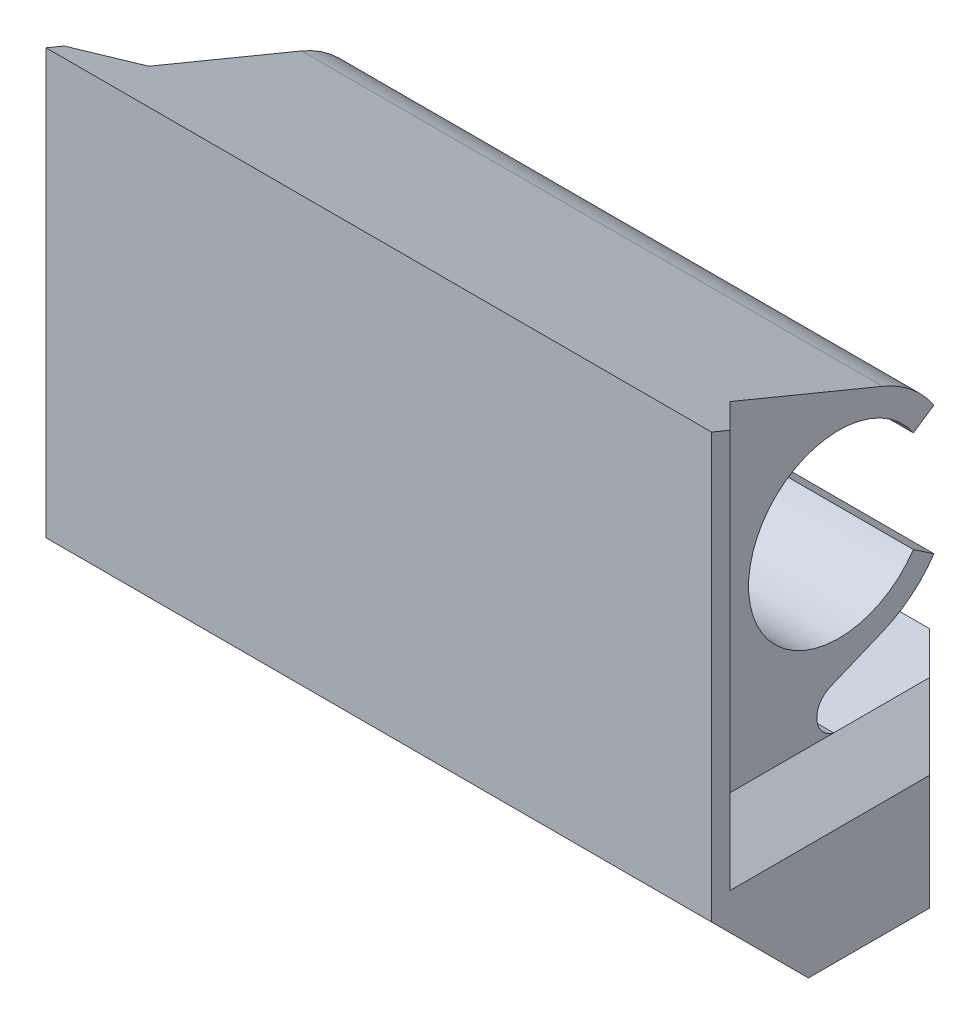
ISO-10303-21;
HEADER;
FILE_DESCRIPTION(('STEP AP214'),'2;1');
FILE_NAME('part.step','',(''),(''),'','','');
FILE_SCHEMA(('AUTOMOTIVE_DESIGN { 1 0 10303 214 1 1 1 1 }'));
ENDSEC;
DATA;
#1=APPLICATION_CONTEXT('core data for automotive mechanical design processes');
#2=APPLICATION_PROTOCOL_DEFINITION('international standard','automotive_design',2000,#1);
#3=PRODUCT_CONTEXT('',#1,'mechanical');
#4=PRODUCT('Part','Part','',(#3));
#5=PRODUCT_RELATED_PRODUCT_CATEGORY('part','',(#4));
#6=PRODUCT_DEFINITION_FORMATION('','',#4);
#7=PRODUCT_DEFINITION_CONTEXT('part definition',#1,'design');
#8=PRODUCT_DEFINITION('design','',#6,#7);
#9=PRODUCT_DEFINITION_SHAPE('','',#8);
#10=(LENGTH_UNIT() NAMED_UNIT(*) SI_UNIT(.MILLI.,.METRE.));
#11=(NAMED_UNIT(*) PLANE_ANGLE_UNIT() SI_UNIT($,.RADIAN.));
#12=(NAMED_UNIT(*) SI_UNIT($,.STERADIAN.) SOLID_ANGLE_UNIT());
#13=UNCERTAINTY_MEASURE_WITH_UNIT(LENGTH_MEASURE(1.E-05),#10,'distance_accuracy_value','');
#14=(GEOMETRIC_REPRESENTATION_CONTEXT(3) GLOBAL_UNCERTAINTY_ASSIGNED_CONTEXT((#13)) GLOBAL_UNIT_ASSIGNED_CONTEXT((#10,
#11,#12)) REPRESENTATION_CONTEXT('',''));
#15=CARTESIAN_POINT('',(0.,0.,0.));
#16=DIRECTION('',(0.,0.,1.));
#17=DIRECTION('',(1.,0.,0.));
#18=AXIS2_PLACEMENT_3D('',#15,#16,#17);
#19=CARTESIAN_POINT('',(44.6457740364154,6.77952065166529,-20.));
#20=DIRECTION('',(0.,1.,0.));
#21=DIRECTION('',(0.,0.,1.));
#22=AXIS2_PLACEMENT_3D('',#19,#20,#21);
#23=PLANE('',#22);
#24=DIRECTION('',(0.,0.,-1.));
#25=VECTOR('',#24,1.);
#26=CARTESIAN_POINT('',(41.1457740364154,6.77952065166529,-20.));
#27=LINE('',#26,#25);
#28=CARTESIAN_POINT('',(41.1457740364154,6.77952065166529,-8.5764706950357));
#29=VERTEX_POINT('',#28);
#30=CARTESIAN_POINT('',(41.1457740364154,6.77952065166529,-16.5));
#31=VERTEX_POINT('',#30);
#32=EDGE_CURVE('E229',#29,#31,#27,.T.);
#33=ORIENTED_EDGE('',*,*,#32,.T.);
#34=DIRECTION('',(0.707106781186549,0.,0.707106781186546));
#35=VECTOR('',#34,1.);
#36=CARTESIAN_POINT('',(41.1457740364154,6.77952065166529,-16.5));
#37=LINE('',#36,#35);
#38=CARTESIAN_POINT('',(37.6457740364154,6.77952065166529,-20.));
#39=VERTEX_POINT('',#38);
#40=EDGE_CURVE('E241',#31,#39,#37,.F.);
#41=ORIENTED_EDGE('',*,*,#40,.T.);
#42=DIRECTION('',(-1.,0.,0.));
#43=VECTOR('',#42,1.);
#44=CARTESIAN_POINT('',(44.6457740364154,6.77952065166529,-20.));
#45=LINE('',#44,#43);
#46=CARTESIAN_POINT('',(-3.35422596358456,6.77952065166529,-20.));
#47=VERTEX_POINT('',#46);
#48=EDGE_CURVE('E344',#39,#47,#45,.T.);
#49=ORIENTED_EDGE('',*,*,#48,.T.);
#50=DIRECTION('',(-0.707106781186546,0.,0.707106781186549));
#51=VECTOR('',#50,1.);
#52=CARTESIAN_POINT('',(20.6457740364153,6.77952065166529,-44.));
#53=LINE('',#52,#51);
#54=CARTESIAN_POINT('',(-6.85422596358455,6.77952065166529,-16.5));
#55=VERTEX_POINT('',#54);
#56=EDGE_CURVE('E239',#47,#55,#53,.T.);
#57=ORIENTED_EDGE('',*,*,#56,.T.);
#58=DIRECTION('',(0.,0.,1.));
#59=VECTOR('',#58,1.);
#60=CARTESIAN_POINT('',(-6.85422596358455,6.77952065166529,-20.));
#61=LINE('',#60,#59);
#62=CARTESIAN_POINT('',(-6.85422596358456,6.77952065166529,-8.57647069503573));
#63=VERTEX_POINT('',#62);
#64=EDGE_CURVE('E212',#55,#63,#61,.T.);
#65=ORIENTED_EDGE('',*,*,#64,.T.);
#66=DIRECTION('',(-1.,0.,0.));
#67=VECTOR('',#66,1.);
#68=CARTESIAN_POINT('',(41.1457740364154,6.77952065166528,-8.57647069503573));
#69=LINE('',#68,#67);
#70=EDGE_CURVE('E273',#29,#63,#69,.T.);
#71=ORIENTED_EDGE('',*,*,#70,.F.);
#72=EDGE_LOOP('',(#33,#41,#49,#57,#65,#71));
#73=FACE_BOUND('',#72,.T.);
#74=ADVANCED_FACE('F33',(#73),#23,.T.);
#75=CARTESIAN_POINT('',(-10.3542259635846,-6.22047934833471,5.));
#76=DIRECTION('',(-1.,0.,0.));
#77=DIRECTION('',(0.,0.,1.));
#78=AXIS2_PLACEMENT_3D('',#75,#76,#77);
#79=PLANE('',#78);
#80=DIRECTION('',(0.,0.,-1.));
#81=VECTOR('',#80,1.);
#82=CARTESIAN_POINT('',(-10.3542259635846,3.27952065166527,5.));
#83=LINE('',#82,#81);
#84=CARTESIAN_POINT('',(-10.3542259635846,3.27952065166527,3.50000000000002));
#85=VERTEX_POINT('',#84);
#86=CARTESIAN_POINT('',(-10.3542259635846,3.27952065166527,-13.));
#87=VERTEX_POINT('',#86);
#88=EDGE_CURVE('E216',#85,#87,#83,.T.);
#89=ORIENTED_EDGE('',*,*,#88,.T.);
#90=DIRECTION('',(0.,-1.,0.));
#91=VECTOR('',#90,1.);
#92=CARTESIAN_POINT('',(-10.3542259635846,-6.22047934833471,-13.));
#93=LINE('',#92,#91);
#94=CARTESIAN_POINT('',(-10.3542259635846,-6.22047934833471,-13.));
#95=VERTEX_POINT('',#94);
#96=EDGE_CURVE('E11',#87,#95,#93,.T.);
#97=ORIENTED_EDGE('',*,*,#96,.T.);
#98=DIRECTION('',(0.,0.,-1.));
#99=VECTOR('',#98,1.);
#100=CARTESIAN_POINT('',(-10.3542259635846,-6.22047934833471,5.));
#101=LINE('',#100,#99);
#102=CARTESIAN_POINT('',(-10.3542259635846,-6.22047934833471,-3.00000000000001));
#103=VERTEX_POINT('',#102);
#104=EDGE_CURVE('E198',#103,#95,#101,.T.);
#105=ORIENTED_EDGE('',*,*,#104,.F.);
#106=DIRECTION('',(0.,-0.707106781186546,-0.707106781186549));
#107=VECTOR('',#106,1.);
#108=CARTESIAN_POINT('',(-10.3542259635846,-2.2204793483347,1.00000000000001));
#109=LINE('',#108,#107);
#110=CARTESIAN_POINT('',(-10.3542259635846,1.77952065166527,5.));
#111=VERTEX_POINT('',#110);
#112=EDGE_CURVE('E210',#103,#111,#109,.F.);
#113=ORIENTED_EDGE('',*,*,#112,.T.);
#114=DIRECTION('',(0.,1.,0.));
#115=VECTOR('',#114,1.);
#116=CARTESIAN_POINT('',(-10.3542259635846,-6.22047934833471,5.));
#117=LINE('',#116,#115);
#118=CARTESIAN_POINT('',(-10.3542259635846,36.8463738964464,5.));
#119=VERTEX_POINT('',#118);
#120=EDGE_CURVE('E196',#111,#119,#117,.T.);
#121=ORIENTED_EDGE('',*,*,#120,.T.);
#122=DIRECTION('',(0.,0.382018430191151,0.92415470511938));
#123=VECTOR('',#122,1.);
#124=CARTESIAN_POINT('',(-10.3542259635846,34.7795206516653,0.));
#125=LINE('',#124,#123);
#126=CARTESIAN_POINT('',(-10.3542259635846,36.2263179230121,3.50000000000002));
#127=VERTEX_POINT('',#126);
#128=EDGE_CURVE('E181',#127,#119,#125,.T.);
#129=ORIENTED_EDGE('',*,*,#128,.F.);
#130=DIRECTION('',(0.,-1.,0.));
#131=VECTOR('',#130,1.);
#132=CARTESIAN_POINT('',(-10.3542259635846,-6.22047934833471,3.50000000000002));
#133=LINE('',#132,#131);
#134=EDGE_CURVE('E214',#127,#85,#133,.T.);
#135=ORIENTED_EDGE('',*,*,#134,.T.);
#136=EDGE_LOOP('',(#89,#97,#105,#113,#121,#129,#135));
#137=FACE_BOUND('',#136,.T.);
#138=ADVANCED_FACE('F367',(#137),#79,.T.);
#139=CARTESIAN_POINT('',(-10.3542259635846,-6.22047934833471,5.));
#140=DIRECTION('',(0.,1.,0.));
#141=DIRECTION('',(0.,0.,1.));
#142=AXIS2_PLACEMENT_3D('',#139,#140,#141);
#143=PLANE('',#142);
#144=CARTESIAN_POINT('',(-0.354225963584559,-6.22047934833471,-11.));
#145=DIRECTION('',(0.,-1.,0.));
#146=DIRECTION('',(0.,0.,-1.));
#147=AXIS2_PLACEMENT_3D('',#144,#145,#146);
#148=CIRCLE('',#147,4.5);
#149=CARTESIAN_POINT('',(-0.354225963584559,-6.22047934833471,-15.5));
#150=VERTEX_POINT('',#149);
#151=EDGE_CURVE('E345',#150,#150,#148,.T.);
#152=ORIENTED_EDGE('',*,*,#151,.F.);
#153=EDGE_LOOP('',(#152));
#154=FACE_BOUND('',#153,.T.);
#155=CARTESIAN_POINT('',(34.6457740364154,-6.22047934833471,-11.));
#156=DIRECTION('',(0.,-1.,0.));
#157=DIRECTION('',(0.,0.,-1.));
#158=AXIS2_PLACEMENT_3D('',#155,#156,#157);
#159=CIRCLE('',#158,4.5);
#160=CARTESIAN_POINT('',(34.6457740364154,-6.22047934833471,-15.5));
#161=VERTEX_POINT('',#160);
#162=EDGE_CURVE('E280',#161,#161,#159,.T.);
#163=ORIENTED_EDGE('',*,*,#162,.F.);
#164=EDGE_LOOP('',(#163));
#165=FACE_BOUND('',#164,.T.);
#166=DIRECTION('',(-1.,0.,0.));
#167=VECTOR('',#166,1.);
#168=CARTESIAN_POINT('',(44.6457740364154,-6.22047934833471,-20.));
#169=LINE('',#168,#167);
#170=CARTESIAN_POINT('',(37.6457740364154,-6.22047934833471,-20.));
#171=VERTEX_POINT('',#170);
#172=CARTESIAN_POINT('',(-3.35422596358456,-6.22047934833471,-20.));
#173=VERTEX_POINT('',#172);
#174=EDGE_CURVE('E200',#171,#173,#169,.T.);
#175=ORIENTED_EDGE('',*,*,#174,.F.);
#176=DIRECTION('',(-0.707106781186549,0.,-0.707106781186546));
#177=VECTOR('',#176,1.);
#178=CARTESIAN_POINT('',(44.6457740364154,-6.22047934833471,-13.));
#179=LINE('',#178,#177);
#180=CARTESIAN_POINT('',(44.6457740364154,-6.22047934833471,-13.));
#181=VERTEX_POINT('',#180);
#182=EDGE_CURVE('E250',#171,#181,#179,.F.);
#183=ORIENTED_EDGE('',*,*,#182,.T.);
#184=DIRECTION('',(0.,0.,-1.));
#185=VECTOR('',#184,1.);
#186=CARTESIAN_POINT('',(44.6457740364154,-6.22047934833471,5.));
#187=LINE('',#186,#185);
#188=CARTESIAN_POINT('',(44.6457740364154,-6.22047934833471,-3.00000000000001));
#189=VERTEX_POINT('',#188);
#190=EDGE_CURVE('E195',#189,#181,#187,.T.);
#191=ORIENTED_EDGE('',*,*,#190,.F.);
#192=DIRECTION('',(-1.,0.,0.));
#193=VECTOR('',#192,1.);
#194=CARTESIAN_POINT('',(-10.3542259635846,-6.22047934833471,-3.00000000000001));
#195=LINE('',#194,#193);
#196=EDGE_CURVE('E208',#189,#103,#195,.T.);
#197=ORIENTED_EDGE('',*,*,#196,.T.);
#198=ORIENTED_EDGE('',*,*,#104,.T.);
#199=DIRECTION('',(0.707106781186546,0.,-0.707106781186549));
#200=VECTOR('',#199,1.);
#201=CARTESIAN_POINT('',(-3.35422596358457,-6.22047934833471,-20.));
#202=LINE('',#201,#200);
#203=EDGE_CURVE('E248',#95,#173,#202,.T.);
#204=ORIENTED_EDGE('',*,*,#203,.T.);
#205=EDGE_LOOP('',(#175,#183,#191,#197,#198,#204));
#206=FACE_BOUND('',#205,.T.);
#207=ADVANCED_FACE('F255',(#154,#165,#206),#143,.F.);
#208=CARTESIAN_POINT('',(44.6457740364154,-6.22047934833471,5.));
#209=DIRECTION('',(-1.,0.,0.));
#210=DIRECTION('',(0.,0.,1.));
#211=AXIS2_PLACEMENT_3D('',#208,#209,#210);
#212=PLANE('',#211);
#213=ORIENTED_EDGE('',*,*,#190,.T.);
#214=DIRECTION('',(0.,1.,0.));
#215=VECTOR('',#214,1.);
#216=CARTESIAN_POINT('',(44.6457740364154,-6.22047934833471,-13.));
#217=LINE('',#216,#215);
#218=CARTESIAN_POINT('',(44.6457740364154,3.27952065166529,-13.));
#219=VERTEX_POINT('',#218);
#220=EDGE_CURVE('E232',#181,#219,#217,.T.);
#221=ORIENTED_EDGE('',*,*,#220,.T.);
#222=DIRECTION('',(0.,0.,1.));
#223=VECTOR('',#222,1.);
#224=CARTESIAN_POINT('',(44.6457740364154,3.27952065166529,0.));
#225=LINE('',#224,#223);
#226=CARTESIAN_POINT('',(44.6457740364154,3.27952065166529,3.5));
#227=VERTEX_POINT('',#226);
#228=EDGE_CURVE('E220',#219,#227,#225,.T.);
#229=ORIENTED_EDGE('',*,*,#228,.T.);
#230=DIRECTION('',(0.,1.,0.));
#231=VECTOR('',#230,1.);
#232=CARTESIAN_POINT('',(44.6457740364154,34.7795206516653,3.5));
#233=LINE('',#232,#231);
#234=CARTESIAN_POINT('',(44.6457740364154,36.2263179230121,3.5));
#235=VERTEX_POINT('',#234);
#236=EDGE_CURVE('E178',#227,#235,#233,.T.);
#237=ORIENTED_EDGE('',*,*,#236,.T.);
#238=DIRECTION('',(0.,0.382018430191151,0.92415470511938));
#239=VECTOR('',#238,1.);
#240=CARTESIAN_POINT('',(44.6457740364154,34.7795206516653,0.));
#241=LINE('',#240,#239);
#242=CARTESIAN_POINT('',(44.6457740364154,36.8463738964464,5.));
#243=VERTEX_POINT('',#242);
#244=EDGE_CURVE('E171',#235,#243,#241,.T.);
#245=ORIENTED_EDGE('',*,*,#244,.T.);
#246=DIRECTION('',(0.,1.,0.));
#247=VECTOR('',#246,1.);
#248=CARTESIAN_POINT('',(44.6457740364154,-6.22047934833471,5.));
#249=LINE('',#248,#247);
#250=CARTESIAN_POINT('',(44.6457740364154,1.77952065166527,5.));
#251=VERTEX_POINT('',#250);
#252=EDGE_CURVE('E176',#251,#243,#249,.T.);
#253=ORIENTED_EDGE('',*,*,#252,.F.);
#254=DIRECTION('',(0.,0.707106781186546,0.707106781186549));
#255=VECTOR('',#254,1.);
#256=CARTESIAN_POINT('',(44.6457740364154,1.77952065166528,5.));
#257=LINE('',#256,#255);
#258=EDGE_CURVE('E206',#251,#189,#257,.F.);
#259=ORIENTED_EDGE('',*,*,#258,.T.);
#260=EDGE_LOOP('',(#213,#221,#229,#237,#245,#253,#259));
#261=FACE_BOUND('',#260,.T.);
#262=ADVANCED_FACE('F174',(#261),#212,.F.);
#263=CARTESIAN_POINT('',(0.,0.,5.));
#264=DIRECTION('',(0.,0.,-1.));
#265=DIRECTION('',(-1.,0.,0.));
#266=AXIS2_PLACEMENT_3D('',#263,#264,#265);
#267=PLANE('',#266);
#268=ORIENTED_EDGE('',*,*,#252,.T.);
#269=DIRECTION('',(-1.,0.,0.));
#270=VECTOR('',#269,1.);
#271=CARTESIAN_POINT('',(44.6457740364154,36.8463738964464,5.));
#272=LINE('',#271,#270);
#273=EDGE_CURVE('E180',#243,#119,#272,.T.);
#274=ORIENTED_EDGE('',*,*,#273,.T.);
#275=ORIENTED_EDGE('',*,*,#120,.F.);
#276=DIRECTION('',(1.,0.,0.));
#277=VECTOR('',#276,1.);
#278=CARTESIAN_POINT('',(0.,1.77952065166528,5.));
#279=LINE('',#278,#277);
#280=EDGE_CURVE('E194',#111,#251,#279,.T.);
#281=ORIENTED_EDGE('',*,*,#280,.T.);
#282=EDGE_LOOP('',(#268,#274,#275,#281));
#283=FACE_BOUND('',#282,.T.);
#284=ADVANCED_FACE('F192',(#283),#267,.F.);
#285=CARTESIAN_POINT('',(0.,0.,-20.));
#286=DIRECTION('',(0.,0.,1.));
#287=DIRECTION('',(1.,0.,0.));
#288=AXIS2_PLACEMENT_3D('',#285,#286,#287);
#289=PLANE('',#288);
#290=ORIENTED_EDGE('',*,*,#48,.F.);
#291=DIRECTION('',(0.,-1.,0.));
#292=VECTOR('',#291,1.);
#293=CARTESIAN_POINT('',(37.6457740364154,0.,-20.));
#294=LINE('',#293,#292);
#295=EDGE_CURVE('E246',#39,#171,#294,.T.);
#296=ORIENTED_EDGE('',*,*,#295,.T.);
#297=ORIENTED_EDGE('',*,*,#174,.T.);
#298=DIRECTION('',(0.,1.,0.));
#299=VECTOR('',#298,1.);
#300=CARTESIAN_POINT('',(-3.35422596358457,3.27952065166527,-20.));
#301=LINE('',#300,#299);
#302=EDGE_CURVE('E243',#173,#47,#301,.T.);
#303=ORIENTED_EDGE('',*,*,#302,.T.);
#304=EDGE_LOOP('',(#290,#296,#297,#303));
#305=FACE_BOUND('',#304,.T.);
#306=ADVANCED_FACE('F355',(#305),#289,.F.);
#307=CARTESIAN_POINT('',(0.,1.77952065166528,5.));
#308=DIRECTION('',(0.,0.707106781186549,-0.707106781186546));
#309=DIRECTION('',(1.,0.,0.));
#310=AXIS2_PLACEMENT_3D('',#307,#308,#309);
#311=PLANE('',#310);
#312=ORIENTED_EDGE('',*,*,#112,.F.);
#313=ORIENTED_EDGE('',*,*,#196,.F.);
#314=ORIENTED_EDGE('',*,*,#258,.F.);
#315=ORIENTED_EDGE('',*,*,#280,.F.);
#316=EDGE_LOOP('',(#312,#313,#314,#315));
#317=FACE_BOUND('',#316,.T.);
#318=ADVANCED_FACE('F433',(#317),#311,.F.);
#319=CARTESIAN_POINT('',(34.6457740364154,1.77952065166529,-11.));
#320=DIRECTION('',(0.,-1.,0.));
#321=DIRECTION('',(0.,0.,-1.));
#322=AXIS2_PLACEMENT_3D('',#319,#320,#321);
#323=CYLINDRICAL_SURFACE('',#322,4.5);
#324=CARTESIAN_POINT('',(34.6457740364154,1.77952065166529,-11.));
#325=DIRECTION('',(0.,-1.,0.));
#326=DIRECTION('',(0.,0.,-1.));
#327=AXIS2_PLACEMENT_3D('',#324,#325,#326);
#328=CIRCLE('',#327,4.5);
#329=CARTESIAN_POINT('',(34.6457740364154,1.77952065166529,-15.5));
#330=VERTEX_POINT('',#329);
#331=EDGE_CURVE('E348',#330,#330,#328,.T.);
#332=ORIENTED_EDGE('',*,*,#331,.F.);
#333=EDGE_LOOP('',(#332));
#334=FACE_BOUND('',#333,.T.);
#335=ORIENTED_EDGE('',*,*,#162,.T.);
#336=EDGE_LOOP('',(#335));
#337=FACE_BOUND('',#336,.T.);
#338=ADVANCED_FACE('F436',(#334,#337),#323,.F.);
#339=CARTESIAN_POINT('',(34.6457740364154,1.77952065166529,-11.));
#340=DIRECTION('',(0.,-1.,0.));
#341=DIRECTION('',(0.,0.,-1.));
#342=AXIS2_PLACEMENT_3D('',#339,#340,#341);
#343=PLANE('',#342);
#344=ORIENTED_EDGE('',*,*,#331,.T.);
#345=EDGE_LOOP('',(#344));
#346=FACE_BOUND('',#345,.T.);
#347=ADVANCED_FACE('F474',(#346),#343,.T.);
#348=CARTESIAN_POINT('',(-0.354225963584559,1.77952065166529,-11.));
#349=DIRECTION('',(0.,-1.,0.));
#350=DIRECTION('',(0.,0.,-1.));
#351=AXIS2_PLACEMENT_3D('',#348,#349,#350);
#352=CYLINDRICAL_SURFACE('',#351,4.5);
#353=CARTESIAN_POINT('',(-0.354225963584559,1.77952065166529,-11.));
#354=DIRECTION('',(0.,-1.,0.));
#355=DIRECTION('',(0.,0.,-1.));
#356=AXIS2_PLACEMENT_3D('',#353,#354,#355);
#357=CIRCLE('',#356,4.5);
#358=CARTESIAN_POINT('',(-0.354225963584559,1.77952065166529,-15.5));
#359=VERTEX_POINT('',#358);
#360=EDGE_CURVE('E341',#359,#359,#357,.T.);
#361=ORIENTED_EDGE('',*,*,#360,.F.);
#362=EDGE_LOOP('',(#361));
#363=FACE_BOUND('',#362,.T.);
#364=ORIENTED_EDGE('',*,*,#151,.T.);
#365=EDGE_LOOP('',(#364));
#366=FACE_BOUND('',#365,.T.);
#367=ADVANCED_FACE('F470',(#363,#366),#352,.F.);
#368=CARTESIAN_POINT('',(-0.354225963584559,1.77952065166529,-11.));
#369=DIRECTION('',(0.,-1.,0.));
#370=DIRECTION('',(0.,0.,-1.));
#371=AXIS2_PLACEMENT_3D('',#368,#369,#370);
#372=PLANE('',#371);
#373=ORIENTED_EDGE('',*,*,#360,.T.);
#374=EDGE_LOOP('',(#373));
#375=FACE_BOUND('',#374,.T.);
#376=ADVANCED_FACE('F452',(#375),#372,.T.);
#377=CARTESIAN_POINT('',(41.1457740364154,8.54026485817867,-8.99999999999999));
#378=DIRECTION('',(-1.,0.,0.));
#379=DIRECTION('',(0.,0.,1.));
#380=AXIS2_PLACEMENT_3D('',#377,#378,#379);
#381=CYLINDRICAL_SURFACE('',#380,1.81096582875933);
#382=CARTESIAN_POINT('',(-6.85422596358456,8.54026485817867,-8.99999999999999));
#383=DIRECTION('',(1.,0.,0.));
#384=DIRECTION('',(0.,0.,1.));
#385=AXIS2_PLACEMENT_3D('',#382,#383,#384);
#386=CIRCLE('',#385,1.81096582875933);
#387=CARTESIAN_POINT('',(-6.85422596358456,10.213877449637,-8.30817767696753));
#388=VERTEX_POINT('',#387);
#389=EDGE_CURVE('E292',#388,#63,#386,.T.);
#390=ORIENTED_EDGE('',*,*,#389,.F.);
#391=DIRECTION('',(-1.,0.,0.));
#392=VECTOR('',#391,1.);
#393=CARTESIAN_POINT('',(41.1457740364154,10.213877449637,-8.30817767696753));
#394=LINE('',#393,#392);
#395=CARTESIAN_POINT('',(41.1457740364154,10.213877449637,-8.30817767696753));
#396=VERTEX_POINT('',#395);
#397=EDGE_CURVE('E281',#396,#388,#394,.T.);
#398=ORIENTED_EDGE('',*,*,#397,.F.);
#399=CARTESIAN_POINT('',(41.1457740364154,8.54026485817867,-8.99999999999999));
#400=DIRECTION('',(1.,0.,0.));
#401=DIRECTION('',(0.,0.,1.));
#402=AXIS2_PLACEMENT_3D('',#399,#400,#401);
#403=CIRCLE('',#402,1.81096582875933);
#404=EDGE_CURVE('E288',#396,#29,#403,.T.);
#405=ORIENTED_EDGE('',*,*,#404,.T.);
#406=ORIENTED_EDGE('',*,*,#70,.T.);
#407=EDGE_LOOP('',(#390,#398,#405,#406));
#408=FACE_BOUND('',#407,.T.);
#409=ADVANCED_FACE('F294',(#408),#381,.F.);
#410=CARTESIAN_POINT('',(41.1457740364154,10.213877449637,-8.30817767696753));
#411=DIRECTION('',(0.,-0.924154705119381,-0.382018430191149));
#412=DIRECTION('',(0.,0.382018430191149,-0.924154705119381));
#413=AXIS2_PLACEMENT_3D('',#410,#411,#412);
#414=PLANE('',#413);
#415=DIRECTION('',(0.,-0.382018430191149,0.924154705119381));
#416=VECTOR('',#415,1.);
#417=CARTESIAN_POINT('',(-6.85422596358456,10.213877449637,-8.30817767696753));
#418=LINE('',#417,#416);
#419=CARTESIAN_POINT('',(-6.85422596358456,12.0000509530765,-12.6291750867972));
#420=VERTEX_POINT('',#419);
#421=EDGE_CURVE('E327',#420,#388,#418,.T.);
#422=ORIENTED_EDGE('',*,*,#421,.F.);
#423=DIRECTION('',(-1.,0.,0.));
#424=VECTOR('',#423,1.);
#425=CARTESIAN_POINT('',(41.1457740364154,12.0000509530765,-12.6291750867972));
#426=LINE('',#425,#424);
#427=CARTESIAN_POINT('',(41.1457740364154,12.0000509530765,-12.6291750867972));
#428=VERTEX_POINT('',#427);
#429=EDGE_CURVE('E332',#428,#420,#426,.T.);
#430=ORIENTED_EDGE('',*,*,#429,.F.);
#431=DIRECTION('',(0.,-0.382018430191149,0.924154705119381));
#432=VECTOR('',#431,1.);
#433=CARTESIAN_POINT('',(41.1457740364154,10.213877449637,-8.30817767696753));
#434=LINE('',#433,#432);
#435=EDGE_CURVE('E297',#428,#396,#434,.T.);
#436=ORIENTED_EDGE('',*,*,#435,.T.);
#437=ORIENTED_EDGE('',*,*,#397,.T.);
#438=EDGE_LOOP('',(#422,#430,#436,#437));
#439=FACE_BOUND('',#438,.T.);
#440=ADVANCED_FACE('F451',(#439),#414,.T.);
#441=CARTESIAN_POINT('',(41.1457740364154,20.7795206516653,-8.99999999999999));
#442=DIRECTION('',(-1.,0.,0.));
#443=DIRECTION('',(0.,0.,1.));
#444=AXIS2_PLACEMENT_3D('',#441,#442,#443);
#445=CYLINDRICAL_SURFACE('',#444,9.49999999995097);
#446=CARTESIAN_POINT('',(-6.85422596358456,20.7795206516653,-8.99999999999999));
#447=DIRECTION('',(-1.,0.,0.));
#448=DIRECTION('',(0.,0.,1.));
#449=AXIS2_PLACEMENT_3D('',#446,#447,#448);
#450=CIRCLE('',#449,9.49999999995097);
#451=CARTESIAN_POINT('',(-6.85422596358456,15.4570600777609,-16.8690160400333));
#452=VERTEX_POINT('',#451);
#453=EDGE_CURVE('E324',#452,#420,#450,.T.);
#454=ORIENTED_EDGE('',*,*,#453,.F.);
#455=DIRECTION('',(-1.,0.,0.));
#456=VECTOR('',#455,1.);
#457=CARTESIAN_POINT('',(41.1457740364154,15.4570600777609,-16.8690160400333));
#458=LINE('',#457,#456);
#459=CARTESIAN_POINT('',(41.1457740364154,15.4570600777609,-16.8690160400333));
#460=VERTEX_POINT('',#459);
#461=EDGE_CURVE('E334',#460,#452,#458,.T.);
#462=ORIENTED_EDGE('',*,*,#461,.F.);
#463=CARTESIAN_POINT('',(41.1457740364154,20.7795206516653,-8.99999999999999));
#464=DIRECTION('',(-1.,0.,0.));
#465=DIRECTION('',(0.,0.,1.));
#466=AXIS2_PLACEMENT_3D('',#463,#464,#465);
#467=CIRCLE('',#466,9.49999999995097);
#468=EDGE_CURVE('E301',#460,#428,#467,.T.);
#469=ORIENTED_EDGE('',*,*,#468,.T.);
#470=ORIENTED_EDGE('',*,*,#429,.T.);
#471=EDGE_LOOP('',(#454,#462,#469,#470));
#472=FACE_BOUND('',#471,.T.);
#473=ADVANCED_FACE('F389',(#472),#445,.T.);
#474=CARTESIAN_POINT('',(41.1457740364154,16.6055910436871,-15.1709652103738));
#475=DIRECTION('',(0.,0.82831747790252,-0.560259007782301));
#476=DIRECTION('',(0.,0.560259007782301,0.82831747790252));
#477=AXIS2_PLACEMENT_3D('',#474,#475,#476);
#478=PLANE('',#477);
#479=DIRECTION('',(0.,-0.560259007782301,-0.82831747790252));
#480=VECTOR('',#479,1.);
#481=CARTESIAN_POINT('',(-6.85422596358456,16.6055910436871,-15.1709652103738));
#482=LINE('',#481,#480);
#483=CARTESIAN_POINT('',(-6.85422596358456,16.6055910436871,-15.1709652103738));
#484=VERTEX_POINT('',#483);
#485=EDGE_CURVE('E321',#484,#452,#482,.T.);
#486=ORIENTED_EDGE('',*,*,#485,.F.);
#487=DIRECTION('',(-1.,0.,0.));
#488=VECTOR('',#487,1.);
#489=CARTESIAN_POINT('',(41.1457740364154,16.6055910436871,-15.1709652103738));
#490=LINE('',#489,#488);
#491=CARTESIAN_POINT('',(41.1457740364154,16.6055910436871,-15.1709652103738));
#492=VERTEX_POINT('',#491);
#493=EDGE_CURVE('E336',#492,#484,#490,.T.);
#494=ORIENTED_EDGE('',*,*,#493,.F.);
#495=DIRECTION('',(0.,-0.560259007782301,-0.82831747790252));
#496=VECTOR('',#495,1.);
#497=CARTESIAN_POINT('',(41.1457740364154,16.6055910436871,-15.1709652103738));
#498=LINE('',#497,#496);
#499=EDGE_CURVE('E383',#492,#460,#498,.T.);
#500=ORIENTED_EDGE('',*,*,#499,.T.);
#501=ORIENTED_EDGE('',*,*,#461,.T.);
#502=EDGE_LOOP('',(#486,#494,#500,#501));
#503=FACE_BOUND('',#502,.T.);
#504=ADVANCED_FACE('F395',(#503),#478,.T.);
#505=CARTESIAN_POINT('',(41.1457740364154,20.7795206516653,-8.99999999999999));
#506=DIRECTION('',(-1.,0.,0.));
#507=DIRECTION('',(0.,0.,1.));
#508=AXIS2_PLACEMENT_3D('',#505,#506,#507);
#509=CYLINDRICAL_SURFACE('',#508,7.45);
#510=CARTESIAN_POINT('',(-6.85422596358456,20.7795206516653,-8.99999999999999));
#511=DIRECTION('',(1.,0.,0.));
#512=DIRECTION('',(0.,0.,1.));
#513=AXIS2_PLACEMENT_3D('',#510,#511,#512);
#514=CIRCLE('',#513,7.45);
#515=CARTESIAN_POINT('',(-6.85422596358456,24.9534502596434,-15.1709652103738));
#516=VERTEX_POINT('',#515);
#517=EDGE_CURVE('E318',#516,#484,#514,.T.);
#518=ORIENTED_EDGE('',*,*,#517,.F.);
#519=DIRECTION('',(-1.,0.,0.));
#520=VECTOR('',#519,1.);
#521=CARTESIAN_POINT('',(41.1457740364154,24.9534502596434,-15.1709652103738));
#522=LINE('',#521,#520);
#523=CARTESIAN_POINT('',(41.1457740364154,24.9534502596434,-15.1709652103738));
#524=VERTEX_POINT('',#523);
#525=EDGE_CURVE('E338',#524,#516,#522,.T.);
#526=ORIENTED_EDGE('',*,*,#525,.F.);
#527=CARTESIAN_POINT('',(41.1457740364154,20.7795206516653,-8.99999999999999));
#528=DIRECTION('',(1.,0.,0.));
#529=DIRECTION('',(0.,0.,1.));
#530=AXIS2_PLACEMENT_3D('',#527,#528,#529);
#531=CIRCLE('',#530,7.45);
#532=EDGE_CURVE('E380',#524,#492,#531,.T.);
#533=ORIENTED_EDGE('',*,*,#532,.T.);
#534=ORIENTED_EDGE('',*,*,#493,.T.);
#535=EDGE_LOOP('',(#518,#526,#533,#534));
#536=FACE_BOUND('',#535,.T.);
#537=ADVANCED_FACE('F398',(#536),#509,.F.);
#538=CARTESIAN_POINT('',(41.1457740364154,24.9534502596434,-15.1709652103738));
#539=DIRECTION('',(0.,-0.82831747790252,-0.560259007782301));
#540=DIRECTION('',(0.,0.560259007782301,-0.82831747790252));
#541=AXIS2_PLACEMENT_3D('',#538,#539,#540);
#542=PLANE('',#541);
#543=DIRECTION('',(0.,-0.560259007782301,0.82831747790252));
#544=VECTOR('',#543,1.);
#545=CARTESIAN_POINT('',(-6.85422596358456,24.9534502596434,-15.1709652103738));
#546=LINE('',#545,#544);
#547=CARTESIAN_POINT('',(-6.85422596358456,26.1019812255697,-16.8690160400333));
#548=VERTEX_POINT('',#547);
#549=EDGE_CURVE('E315',#548,#516,#546,.T.);
#550=ORIENTED_EDGE('',*,*,#549,.F.);
#551=DIRECTION('',(-1.,0.,0.));
#552=VECTOR('',#551,1.);
#553=CARTESIAN_POINT('',(41.1457740364154,26.1019812255697,-16.8690160400333));
#554=LINE('',#553,#552);
#555=CARTESIAN_POINT('',(41.1457740364154,26.1019812255697,-16.8690160400333));
#556=VERTEX_POINT('',#555);
#557=EDGE_CURVE('E299',#556,#548,#554,.T.);
#558=ORIENTED_EDGE('',*,*,#557,.F.);
#559=DIRECTION('',(0.,-0.560259007782301,0.82831747790252));
#560=VECTOR('',#559,1.);
#561=CARTESIAN_POINT('',(41.1457740364154,24.9534502596434,-15.1709652103738));
#562=LINE('',#561,#560);
#563=EDGE_CURVE('E377',#556,#524,#562,.T.);
#564=ORIENTED_EDGE('',*,*,#563,.T.);
#565=ORIENTED_EDGE('',*,*,#525,.T.);
#566=EDGE_LOOP('',(#550,#558,#564,#565));
#567=FACE_BOUND('',#566,.T.);
#568=ADVANCED_FACE('F403',(#567),#542,.T.);
#569=CARTESIAN_POINT('',(41.1457740364154,20.7795206516653,-8.99999999999999));
#570=DIRECTION('',(-1.,0.,0.));
#571=DIRECTION('',(0.,0.,1.));
#572=AXIS2_PLACEMENT_3D('',#569,#570,#571);
#573=CYLINDRICAL_SURFACE('',#572,9.49999999995097);
#574=CARTESIAN_POINT('',(-6.85422596358456,20.7795206516653,-8.99999999999999));
#575=DIRECTION('',(-1.,0.,0.));
#576=DIRECTION('',(0.,0.,1.));
#577=AXIS2_PLACEMENT_3D('',#574,#575,#576);
#578=CIRCLE('',#577,9.49999999995097);
#579=CARTESIAN_POINT('',(-6.85422596358456,29.5589903502541,-12.6291750867972));
#580=VERTEX_POINT('',#579);
#581=EDGE_CURVE('E312',#580,#548,#578,.T.);
#582=ORIENTED_EDGE('',*,*,#581,.F.);
#583=DIRECTION('',(-1.,0.,0.));
#584=VECTOR('',#583,1.);
#585=CARTESIAN_POINT('',(41.1457740364154,29.5589903502541,-12.6291750867972));
#586=LINE('',#585,#584);
#587=CARTESIAN_POINT('',(41.1457740364154,29.5589903502541,-12.6291750867972));
#588=VERTEX_POINT('',#587);
#589=EDGE_CURVE('E296',#588,#580,#586,.T.);
#590=ORIENTED_EDGE('',*,*,#589,.F.);
#591=CARTESIAN_POINT('',(41.1457740364154,20.7795206516653,-8.99999999999999));
#592=DIRECTION('',(-1.,0.,0.));
#593=DIRECTION('',(0.,0.,1.));
#594=AXIS2_PLACEMENT_3D('',#591,#592,#593);
#595=CIRCLE('',#594,9.49999999995097);
#596=EDGE_CURVE('E374',#588,#556,#595,.T.);
#597=ORIENTED_EDGE('',*,*,#596,.T.);
#598=ORIENTED_EDGE('',*,*,#557,.T.);
#599=EDGE_LOOP('',(#582,#590,#597,#598));
#600=FACE_BOUND('',#599,.T.);
#601=ADVANCED_FACE('F406',(#600),#573,.T.);
#602=CARTESIAN_POINT('',(41.1457740364154,34.7795206516653,0.));
#603=DIRECTION('',(0.,0.92415470511938,-0.382018430191152));
#604=DIRECTION('',(0.,0.382018430191152,0.92415470511938));
#605=AXIS2_PLACEMENT_3D('',#602,#603,#604);
#606=PLANE('',#605);
#607=ORIENTED_EDGE('',*,*,#244,.F.);
#608=DIRECTION('',(-0.678707365054248,-0.280557703943846,-0.678707365054245));
#609=VECTOR('',#608,1.);
#610=CARTESIAN_POINT('',(41.1457740364154,34.7795206516653,0.));
#611=LINE('',#610,#609);
#612=CARTESIAN_POINT('',(41.1457740364154,34.7795206516653,0.));
#613=VERTEX_POINT('',#612);
#614=EDGE_CURVE('E227',#235,#613,#611,.T.);
#615=ORIENTED_EDGE('',*,*,#614,.T.);
#616=DIRECTION('',(0.,-0.382018430191152,-0.92415470511938));
#617=VECTOR('',#616,1.);
#618=CARTESIAN_POINT('',(41.1457740364154,34.7795206516653,0.));
#619=LINE('',#618,#617);
#620=EDGE_CURVE('E371',#613,#588,#619,.T.);
#621=ORIENTED_EDGE('',*,*,#620,.T.);
#622=ORIENTED_EDGE('',*,*,#589,.T.);
#623=DIRECTION('',(0.,-0.382018430191152,-0.92415470511938));
#624=VECTOR('',#623,1.);
#625=CARTESIAN_POINT('',(-6.85422596358456,34.7795206516653,0.));
#626=LINE('',#625,#624);
#627=CARTESIAN_POINT('',(-6.85422596358456,34.7795206516653,0.));
#628=VERTEX_POINT('',#627);
#629=EDGE_CURVE('E309',#628,#580,#626,.T.);
#630=ORIENTED_EDGE('',*,*,#629,.F.);
#631=DIRECTION('',(0.678707365054245,-0.280557703943847,-0.678707365054248));
#632=VECTOR('',#631,1.);
#633=CARTESIAN_POINT('',(15.2566710306015,25.6395248121742,-22.1108969941862));
#634=LINE('',#633,#632);
#635=EDGE_CURVE('E218',#628,#127,#634,.F.);
#636=ORIENTED_EDGE('',*,*,#635,.T.);
#637=ORIENTED_EDGE('',*,*,#128,.T.);
#638=ORIENTED_EDGE('',*,*,#273,.F.);
#639=EDGE_LOOP('',(#607,#615,#621,#622,#630,#636,#637,#638));
#640=FACE_BOUND('',#639,.T.);
#641=ADVANCED_FACE('F184',(#640),#606,.T.);
#642=CARTESIAN_POINT('',(41.1457740364154,8.54026485817867,-8.99999999999999));
#643=DIRECTION('',(-1.,0.,0.));
#644=DIRECTION('',(0.,0.,1.));
#645=AXIS2_PLACEMENT_3D('',#642,#643,#644);
#646=PLANE('',#645);
#647=DIRECTION('',(0.,0.,1.));
#648=VECTOR('',#647,1.);
#649=CARTESIAN_POINT('',(41.1457740364154,6.77952065166529,0.));
#650=LINE('',#649,#648);
#651=CARTESIAN_POINT('',(41.1457740364154,6.77952065166529,0.));
#652=VERTEX_POINT('',#651);
#653=EDGE_CURVE('E285',#29,#652,#650,.T.);
#654=ORIENTED_EDGE('',*,*,#653,.F.);
#655=ORIENTED_EDGE('',*,*,#404,.F.);
#656=ORIENTED_EDGE('',*,*,#435,.F.);
#657=ORIENTED_EDGE('',*,*,#468,.F.);
#658=ORIENTED_EDGE('',*,*,#499,.F.);
#659=ORIENTED_EDGE('',*,*,#532,.F.);
#660=ORIENTED_EDGE('',*,*,#563,.F.);
#661=ORIENTED_EDGE('',*,*,#596,.F.);
#662=ORIENTED_EDGE('',*,*,#620,.F.);
#663=DIRECTION('',(0.,1.,0.));
#664=VECTOR('',#663,1.);
#665=CARTESIAN_POINT('',(41.1457740364154,34.7795206516653,0.));
#666=LINE('',#665,#664);
#667=EDGE_CURVE('E291',#652,#613,#666,.T.);
#668=ORIENTED_EDGE('',*,*,#667,.F.);
#669=EDGE_LOOP('',(#654,#655,#656,#657,#658,#659,#660,#661,#662,#668));
#670=FACE_BOUND('',#669,.T.);
#671=ADVANCED_FACE('F286',(#670),#646,.F.);
#672=CARTESIAN_POINT('',(-6.85422596358456,8.54026485817867,-8.99999999999999));
#673=DIRECTION('',(-1.,0.,0.));
#674=DIRECTION('',(0.,0.,1.));
#675=AXIS2_PLACEMENT_3D('',#672,#673,#674);
#676=PLANE('',#675);
#677=DIRECTION('',(0.,0.,1.));
#678=VECTOR('',#677,1.);
#679=CARTESIAN_POINT('',(-6.85422596358456,6.77952065166529,0.));
#680=LINE('',#679,#678);
#681=CARTESIAN_POINT('',(-6.85422596358456,6.77952065166529,0.));
#682=VERTEX_POINT('',#681);
#683=EDGE_CURVE('E189',#63,#682,#680,.T.);
#684=ORIENTED_EDGE('',*,*,#683,.T.);
#685=DIRECTION('',(0.,1.,0.));
#686=VECTOR('',#685,1.);
#687=CARTESIAN_POINT('',(-6.85422596358456,34.7795206516653,0.));
#688=LINE('',#687,#686);
#689=EDGE_CURVE('E306',#682,#628,#688,.T.);
#690=ORIENTED_EDGE('',*,*,#689,.T.);
#691=ORIENTED_EDGE('',*,*,#629,.T.);
#692=ORIENTED_EDGE('',*,*,#581,.T.);
#693=ORIENTED_EDGE('',*,*,#549,.T.);
#694=ORIENTED_EDGE('',*,*,#517,.T.);
#695=ORIENTED_EDGE('',*,*,#485,.T.);
#696=ORIENTED_EDGE('',*,*,#453,.T.);
#697=ORIENTED_EDGE('',*,*,#421,.T.);
#698=ORIENTED_EDGE('',*,*,#389,.T.);
#699=EDGE_LOOP('',(#684,#690,#691,#692,#693,#694,#695,#696,#697,#698));
#700=FACE_BOUND('',#699,.T.);
#701=ADVANCED_FACE('F362',(#700),#676,.T.);
#702=CARTESIAN_POINT('',(-6.85422596358455,0.,0.));
#703=DIRECTION('',(0.707106781186549,0.,0.707106781186546));
#704=DIRECTION('',(0.,1.,0.));
#705=AXIS2_PLACEMENT_3D('',#702,#703,#704);
#706=PLANE('',#705);
#707=ORIENTED_EDGE('',*,*,#635,.F.);
#708=ORIENTED_EDGE('',*,*,#689,.F.);
#709=DIRECTION('',(-0.577350269189625,-0.577350269189626,0.577350269189627));
#710=VECTOR('',#709,1.);
#711=CARTESIAN_POINT('',(-0.18755929691789,13.446187318332,-6.66666666666669));
#712=LINE('',#711,#710);
#713=EDGE_CURVE('E221',#85,#682,#712,.F.);
#714=ORIENTED_EDGE('',*,*,#713,.F.);
#715=ORIENTED_EDGE('',*,*,#134,.F.);
#716=EDGE_LOOP('',(#707,#708,#714,#715));
#717=FACE_BOUND('',#716,.T.);
#718=ADVANCED_FACE('F365',(#717),#706,.F.);
#719=CARTESIAN_POINT('',(-6.85422596358455,6.77952065166529,-20.));
#720=DIRECTION('',(0.707106781186549,-0.707106781186547,0.));
#721=DIRECTION('',(0.,0.,1.));
#722=AXIS2_PLACEMENT_3D('',#719,#720,#721);
#723=PLANE('',#722);
#724=ORIENTED_EDGE('',*,*,#64,.F.);
#725=DIRECTION('',(0.577350269189625,0.577350269189626,-0.577350269189627));
#726=VECTOR('',#725,1.);
#727=CARTESIAN_POINT('',(-5.68755929691789,7.94618731833196,-17.6666666666667));
#728=LINE('',#727,#726);
#729=EDGE_CURVE('E41',#55,#87,#728,.F.);
#730=ORIENTED_EDGE('',*,*,#729,.T.);
#731=ORIENTED_EDGE('',*,*,#88,.F.);
#732=ORIENTED_EDGE('',*,*,#713,.T.);
#733=ORIENTED_EDGE('',*,*,#683,.F.);
#734=EDGE_LOOP('',(#724,#730,#731,#732,#733));
#735=FACE_BOUND('',#734,.T.);
#736=ADVANCED_FACE('F358',(#735),#723,.F.);
#737=CARTESIAN_POINT('',(44.6457740364154,3.27952065166529,5.));
#738=DIRECTION('',(0.707106781186546,0.707106781186549,0.));
#739=DIRECTION('',(0.,0.,-1.));
#740=AXIS2_PLACEMENT_3D('',#737,#738,#739);
#741=PLANE('',#740);
#742=ORIENTED_EDGE('',*,*,#228,.F.);
#743=DIRECTION('',(0.577350269189627,-0.577350269189625,0.577350269189625));
#744=VECTOR('',#743,1.);
#745=CARTESIAN_POINT('',(50.6457740364154,-2.7204793483347,-7.00000000000001));
#746=LINE('',#745,#744);
#747=EDGE_CURVE('E237',#219,#31,#746,.F.);
#748=ORIENTED_EDGE('',*,*,#747,.T.);
#749=ORIENTED_EDGE('',*,*,#32,.F.);
#750=ORIENTED_EDGE('',*,*,#653,.T.);
#751=DIRECTION('',(0.577350269189627,-0.577350269189625,0.577350269189625));
#752=VECTOR('',#751,1.);
#753=CARTESIAN_POINT('',(47.8124407030821,0.11285398499863,6.66666666666666));
#754=LINE('',#753,#752);
#755=EDGE_CURVE('E224',#227,#652,#754,.F.);
#756=ORIENTED_EDGE('',*,*,#755,.F.);
#757=EDGE_LOOP('',(#742,#748,#749,#750,#756));
#758=FACE_BOUND('',#757,.T.);
#759=ADVANCED_FACE('F266',(#758),#741,.T.);
#760=CARTESIAN_POINT('',(44.6457740364154,-6.22047934833471,3.5));
#761=DIRECTION('',(0.707106781186546,0.,-0.707106781186549));
#762=DIRECTION('',(0.,-1.,0.));
#763=AXIS2_PLACEMENT_3D('',#760,#761,#762);
#764=PLANE('',#763);
#765=ORIENTED_EDGE('',*,*,#755,.T.);
#766=ORIENTED_EDGE('',*,*,#667,.T.);
#767=ORIENTED_EDGE('',*,*,#614,.F.);
#768=ORIENTED_EDGE('',*,*,#236,.F.);
#769=EDGE_LOOP('',(#765,#766,#767,#768));
#770=FACE_BOUND('',#769,.T.);
#771=ADVANCED_FACE('F408',(#770),#764,.T.);
#772=CARTESIAN_POINT('',(44.6457740364154,-6.22047934833471,-13.));
#773=DIRECTION('',(-0.707106781186546,0.,0.707106781186549));
#774=DIRECTION('',(0.,1.,0.));
#775=AXIS2_PLACEMENT_3D('',#772,#773,#774);
#776=PLANE('',#775);
#777=ORIENTED_EDGE('',*,*,#182,.F.);
#778=ORIENTED_EDGE('',*,*,#295,.F.);
#779=ORIENTED_EDGE('',*,*,#40,.F.);
#780=ORIENTED_EDGE('',*,*,#747,.F.);
#781=ORIENTED_EDGE('',*,*,#220,.F.);
#782=EDGE_LOOP('',(#777,#778,#779,#780,#781));
#783=FACE_BOUND('',#782,.T.);
#784=ADVANCED_FACE('F262',(#783),#776,.F.);
#785=CARTESIAN_POINT('',(-3.35422596358457,0.,-20.));
#786=DIRECTION('',(-0.707106781186549,0.,-0.707106781186546));
#787=DIRECTION('',(0.,-1.,0.));
#788=AXIS2_PLACEMENT_3D('',#785,#786,#787);
#789=PLANE('',#788);
#790=ORIENTED_EDGE('',*,*,#203,.F.);
#791=ORIENTED_EDGE('',*,*,#96,.F.);
#792=ORIENTED_EDGE('',*,*,#729,.F.);
#793=ORIENTED_EDGE('',*,*,#56,.F.);
#794=ORIENTED_EDGE('',*,*,#302,.F.);
#795=EDGE_LOOP('',(#790,#791,#792,#793,#794));
#796=FACE_BOUND('',#795,.T.);
#797=ADVANCED_FACE('F35',(#796),#789,.T.);
#798=CLOSED_SHELL('',(#74,#138,#207,#262,#284,#306,#318,#338,#347,#367,#376,#409,#440,#473,#504,
#537,#568,#601,#641,#671,#701,#718,#736,#759,#771,#784,#797));
#799=MANIFOLD_SOLID_BREP('B2',#798);
#800=ADVANCED_BREP_SHAPE_REPRESENTATION('',(#18,#799),#14);
#801=SHAPE_DEFINITION_REPRESENTATION(#9,#800);
ENDSEC;
END-ISO-10303-21;
